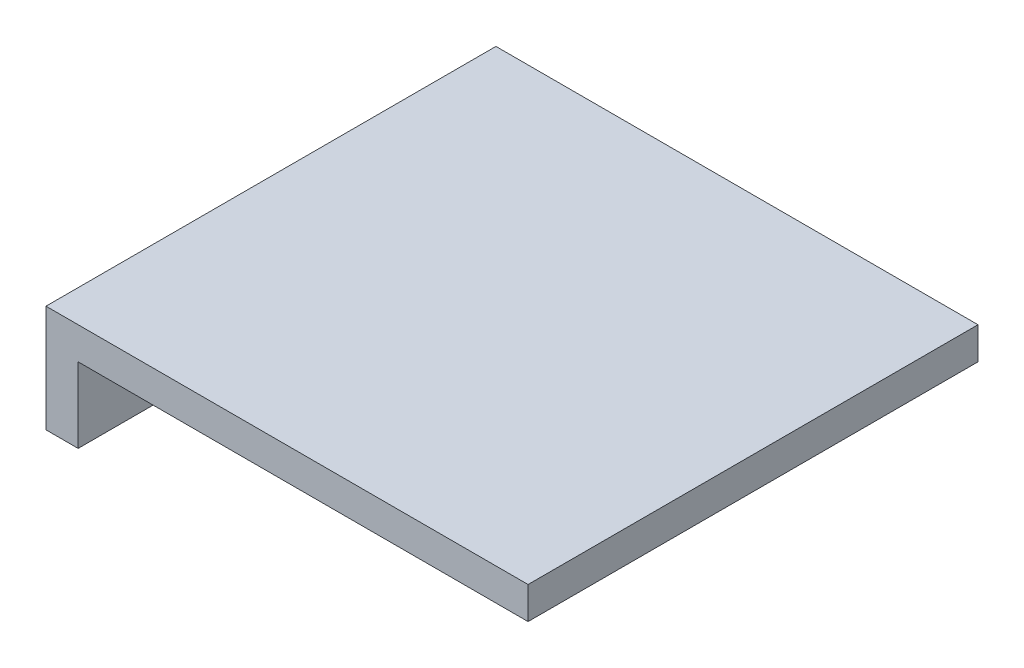
ISO-10303-21;
HEADER;
FILE_DESCRIPTION(('STEP AP214'),'2;1');
FILE_NAME('part.step','',(''),(''),'','','');
FILE_SCHEMA(('AUTOMOTIVE_DESIGN { 1 0 10303 214 1 1 1 1 }'));
ENDSEC;
DATA;
#1=APPLICATION_CONTEXT('core data for automotive mechanical design processes');
#2=APPLICATION_PROTOCOL_DEFINITION('international standard','automotive_design',2000,#1);
#3=PRODUCT_CONTEXT('',#1,'mechanical');
#4=PRODUCT('Part','Part','',(#3));
#5=PRODUCT_RELATED_PRODUCT_CATEGORY('part','',(#4));
#6=PRODUCT_DEFINITION_FORMATION('','',#4);
#7=PRODUCT_DEFINITION_CONTEXT('part definition',#1,'design');
#8=PRODUCT_DEFINITION('design','',#6,#7);
#9=PRODUCT_DEFINITION_SHAPE('','',#8);
#10=(LENGTH_UNIT() NAMED_UNIT(*) SI_UNIT(.MILLI.,.METRE.));
#11=(NAMED_UNIT(*) PLANE_ANGLE_UNIT() SI_UNIT($,.RADIAN.));
#12=(NAMED_UNIT(*) SI_UNIT($,.STERADIAN.) SOLID_ANGLE_UNIT());
#13=UNCERTAINTY_MEASURE_WITH_UNIT(LENGTH_MEASURE(1.E-05),#10,'distance_accuracy_value','');
#14=(GEOMETRIC_REPRESENTATION_CONTEXT(3) GLOBAL_UNCERTAINTY_ASSIGNED_CONTEXT((#13)) GLOBAL_UNIT_ASSIGNED_CONTEXT((#10,
#11,#12)) REPRESENTATION_CONTEXT('',''));
#15=CARTESIAN_POINT('',(0.,0.,0.));
#16=DIRECTION('',(0.,0.,1.));
#17=DIRECTION('',(1.,0.,0.));
#18=AXIS2_PLACEMENT_3D('',#15,#16,#17);
#19=CARTESIAN_POINT('',(-3.,0.,42.));
#20=DIRECTION('',(0.,1.,0.));
#21=DIRECTION('',(0.,0.,1.));
#22=AXIS2_PLACEMENT_3D('',#19,#20,#21);
#23=PLANE('',#22);
#24=DIRECTION('',(1.,0.,0.));
#25=VECTOR('',#24,1.);
#26=CARTESIAN_POINT('',(-3.,0.,0.));
#27=LINE('',#26,#25);
#28=CARTESIAN_POINT('',(-3.,0.,0.));
#29=VERTEX_POINT('',#28);
#30=CARTESIAN_POINT('',(0.,0.,0.));
#31=VERTEX_POINT('',#30);
#32=EDGE_CURVE('E117',#29,#31,#27,.T.);
#33=ORIENTED_EDGE('',*,*,#32,.T.);
#34=DIRECTION('',(0.,0.,-1.));
#35=VECTOR('',#34,1.);
#36=CARTESIAN_POINT('',(0.,0.,42.));
#37=LINE('',#36,#35);
#38=CARTESIAN_POINT('',(0.,0.,42.));
#39=VERTEX_POINT('',#38);
#40=EDGE_CURVE('E11',#39,#31,#37,.T.);
#41=ORIENTED_EDGE('',*,*,#40,.F.);
#42=DIRECTION('',(1.,0.,0.));
#43=VECTOR('',#42,1.);
#44=CARTESIAN_POINT('',(-3.,0.,42.));
#45=LINE('',#44,#43);
#46=CARTESIAN_POINT('',(-3.,0.,42.));
#47=VERTEX_POINT('',#46);
#48=EDGE_CURVE('E127',#47,#39,#45,.T.);
#49=ORIENTED_EDGE('',*,*,#48,.F.);
#50=DIRECTION('',(0.,0.,-1.));
#51=VECTOR('',#50,1.);
#52=CARTESIAN_POINT('',(-3.,0.,42.));
#53=LINE('',#52,#51);
#54=EDGE_CURVE('E113',#47,#29,#53,.T.);
#55=ORIENTED_EDGE('',*,*,#54,.T.);
#56=EDGE_LOOP('',(#33,#41,#49,#55));
#57=FACE_BOUND('',#56,.T.);
#58=ADVANCED_FACE('F33',(#57),#23,.F.);
#59=CARTESIAN_POINT('',(0.,0.,42.));
#60=DIRECTION('',(-1.,0.,0.));
#61=DIRECTION('',(0.,0.,1.));
#62=AXIS2_PLACEMENT_3D('',#59,#60,#61);
#63=PLANE('',#62);
#64=DIRECTION('',(0.,1.,0.));
#65=VECTOR('',#64,1.);
#66=CARTESIAN_POINT('',(0.,0.,0.));
#67=LINE('',#66,#65);
#68=CARTESIAN_POINT('',(0.,7.,0.));
#69=VERTEX_POINT('',#68);
#70=EDGE_CURVE('E120',#31,#69,#67,.T.);
#71=ORIENTED_EDGE('',*,*,#70,.T.);
#72=DIRECTION('',(0.,0.,-1.));
#73=VECTOR('',#72,1.);
#74=CARTESIAN_POINT('',(0.,7.,42.));
#75=LINE('',#74,#73);
#76=CARTESIAN_POINT('',(0.,7.,42.));
#77=VERTEX_POINT('',#76);
#78=EDGE_CURVE('E41',#77,#69,#75,.T.);
#79=ORIENTED_EDGE('',*,*,#78,.F.);
#80=DIRECTION('',(0.,1.,0.));
#81=VECTOR('',#80,1.);
#82=CARTESIAN_POINT('',(0.,0.,42.));
#83=LINE('',#82,#81);
#84=EDGE_CURVE('E86',#39,#77,#83,.T.);
#85=ORIENTED_EDGE('',*,*,#84,.F.);
#86=ORIENTED_EDGE('',*,*,#40,.T.);
#87=EDGE_LOOP('',(#71,#79,#85,#86));
#88=FACE_BOUND('',#87,.T.);
#89=ADVANCED_FACE('F151',(#88),#63,.F.);
#90=CARTESIAN_POINT('',(0.,7.,42.));
#91=DIRECTION('',(0.,1.,0.));
#92=DIRECTION('',(0.,0.,1.));
#93=AXIS2_PLACEMENT_3D('',#90,#91,#92);
#94=PLANE('',#93);
#95=DIRECTION('',(1.,0.,0.));
#96=VECTOR('',#95,1.);
#97=CARTESIAN_POINT('',(0.,7.,0.));
#98=LINE('',#97,#96);
#99=CARTESIAN_POINT('',(42.,7.,0.));
#100=VERTEX_POINT('',#99);
#101=EDGE_CURVE('E122',#69,#100,#98,.T.);
#102=ORIENTED_EDGE('',*,*,#101,.T.);
#103=DIRECTION('',(0.,0.,-1.));
#104=VECTOR('',#103,1.);
#105=CARTESIAN_POINT('',(42.,7.,42.));
#106=LINE('',#105,#104);
#107=CARTESIAN_POINT('',(42.,7.,42.));
#108=VERTEX_POINT('',#107);
#109=EDGE_CURVE('E108',#108,#100,#106,.T.);
#110=ORIENTED_EDGE('',*,*,#109,.F.);
#111=DIRECTION('',(1.,0.,0.));
#112=VECTOR('',#111,1.);
#113=CARTESIAN_POINT('',(0.,7.,42.));
#114=LINE('',#113,#112);
#115=EDGE_CURVE('E99',#77,#108,#114,.T.);
#116=ORIENTED_EDGE('',*,*,#115,.F.);
#117=ORIENTED_EDGE('',*,*,#78,.T.);
#118=EDGE_LOOP('',(#102,#110,#116,#117));
#119=FACE_BOUND('',#118,.T.);
#120=ADVANCED_FACE('F133',(#119),#94,.F.);
#121=CARTESIAN_POINT('',(42.,10.,42.));
#122=DIRECTION('',(-1.,0.,0.));
#123=DIRECTION('',(0.,0.,1.));
#124=AXIS2_PLACEMENT_3D('',#121,#122,#123);
#125=PLANE('',#124);
#126=DIRECTION('',(0.,1.,0.));
#127=VECTOR('',#126,1.);
#128=CARTESIAN_POINT('',(42.,10.,0.));
#129=LINE('',#128,#127);
#130=CARTESIAN_POINT('',(42.,10.,0.));
#131=VERTEX_POINT('',#130);
#132=EDGE_CURVE('E107',#100,#131,#129,.T.);
#133=ORIENTED_EDGE('',*,*,#132,.T.);
#134=DIRECTION('',(0.,0.,-1.));
#135=VECTOR('',#134,1.);
#136=CARTESIAN_POINT('',(42.,10.,42.));
#137=LINE('',#136,#135);
#138=CARTESIAN_POINT('',(42.,10.,42.));
#139=VERTEX_POINT('',#138);
#140=EDGE_CURVE('E104',#139,#131,#137,.T.);
#141=ORIENTED_EDGE('',*,*,#140,.F.);
#142=DIRECTION('',(0.,1.,0.));
#143=VECTOR('',#142,1.);
#144=CARTESIAN_POINT('',(42.,10.,42.));
#145=LINE('',#144,#143);
#146=EDGE_CURVE('E93',#108,#139,#145,.T.);
#147=ORIENTED_EDGE('',*,*,#146,.F.);
#148=ORIENTED_EDGE('',*,*,#109,.T.);
#149=EDGE_LOOP('',(#133,#141,#147,#148));
#150=FACE_BOUND('',#149,.T.);
#151=ADVANCED_FACE('F105',(#150),#125,.F.);
#152=CARTESIAN_POINT('',(-3.,10.,42.));
#153=DIRECTION('',(0.,-1.,0.));
#154=DIRECTION('',(0.,0.,-1.));
#155=AXIS2_PLACEMENT_3D('',#152,#153,#154);
#156=PLANE('',#155);
#157=DIRECTION('',(-1.,0.,0.));
#158=VECTOR('',#157,1.);
#159=CARTESIAN_POINT('',(-3.,10.,0.));
#160=LINE('',#159,#158);
#161=CARTESIAN_POINT('',(-3.,10.,0.));
#162=VERTEX_POINT('',#161);
#163=EDGE_CURVE('E72',#131,#162,#160,.T.);
#164=ORIENTED_EDGE('',*,*,#163,.T.);
#165=DIRECTION('',(0.,0.,-1.));
#166=VECTOR('',#165,1.);
#167=CARTESIAN_POINT('',(-3.,10.,42.));
#168=LINE('',#167,#166);
#169=CARTESIAN_POINT('',(-3.,10.,42.));
#170=VERTEX_POINT('',#169);
#171=EDGE_CURVE('E109',#170,#162,#168,.T.);
#172=ORIENTED_EDGE('',*,*,#171,.F.);
#173=DIRECTION('',(-1.,0.,0.));
#174=VECTOR('',#173,1.);
#175=CARTESIAN_POINT('',(-3.,10.,42.));
#176=LINE('',#175,#174);
#177=EDGE_CURVE('E97',#139,#170,#176,.T.);
#178=ORIENTED_EDGE('',*,*,#177,.F.);
#179=ORIENTED_EDGE('',*,*,#140,.T.);
#180=EDGE_LOOP('',(#164,#172,#178,#179));
#181=FACE_BOUND('',#180,.T.);
#182=ADVANCED_FACE('F111',(#181),#156,.F.);
#183=CARTESIAN_POINT('',(-3.,0.,42.));
#184=DIRECTION('',(1.,0.,0.));
#185=DIRECTION('',(0.,0.,-1.));
#186=AXIS2_PLACEMENT_3D('',#183,#184,#185);
#187=PLANE('',#186);
#188=DIRECTION('',(0.,-1.,0.));
#189=VECTOR('',#188,1.);
#190=CARTESIAN_POINT('',(-3.,0.,0.));
#191=LINE('',#190,#189);
#192=EDGE_CURVE('E78',#162,#29,#191,.T.);
#193=ORIENTED_EDGE('',*,*,#192,.T.);
#194=ORIENTED_EDGE('',*,*,#54,.F.);
#195=DIRECTION('',(0.,-1.,0.));
#196=VECTOR('',#195,1.);
#197=CARTESIAN_POINT('',(-3.,0.,42.));
#198=LINE('',#197,#196);
#199=EDGE_CURVE('E49',#170,#47,#198,.T.);
#200=ORIENTED_EDGE('',*,*,#199,.F.);
#201=ORIENTED_EDGE('',*,*,#171,.T.);
#202=EDGE_LOOP('',(#193,#194,#200,#201));
#203=FACE_BOUND('',#202,.T.);
#204=ADVANCED_FACE('F140',(#203),#187,.F.);
#205=CARTESIAN_POINT('',(0.,0.,42.));
#206=DIRECTION('',(0.,0.,1.));
#207=DIRECTION('',(1.,0.,0.));
#208=AXIS2_PLACEMENT_3D('',#205,#206,#207);
#209=PLANE('',#208);
#210=ORIENTED_EDGE('',*,*,#48,.T.);
#211=ORIENTED_EDGE('',*,*,#84,.T.);
#212=ORIENTED_EDGE('',*,*,#115,.T.);
#213=ORIENTED_EDGE('',*,*,#146,.T.);
#214=ORIENTED_EDGE('',*,*,#177,.T.);
#215=ORIENTED_EDGE('',*,*,#199,.T.);
#216=EDGE_LOOP('',(#210,#211,#212,#213,#214,#215));
#217=FACE_BOUND('',#216,.T.);
#218=ADVANCED_FACE('F95',(#217),#209,.T.);
#219=CARTESIAN_POINT('',(0.,0.,0.));
#220=DIRECTION('',(0.,0.,1.));
#221=DIRECTION('',(1.,0.,0.));
#222=AXIS2_PLACEMENT_3D('',#219,#220,#221);
#223=PLANE('',#222);
#224=ORIENTED_EDGE('',*,*,#32,.F.);
#225=ORIENTED_EDGE('',*,*,#192,.F.);
#226=ORIENTED_EDGE('',*,*,#163,.F.);
#227=ORIENTED_EDGE('',*,*,#132,.F.);
#228=ORIENTED_EDGE('',*,*,#101,.F.);
#229=ORIENTED_EDGE('',*,*,#70,.F.);
#230=EDGE_LOOP('',(#224,#225,#226,#227,#228,#229));
#231=FACE_BOUND('',#230,.T.);
#232=ADVANCED_FACE('F136',(#231),#223,.F.);
#233=CLOSED_SHELL('',(#58,#89,#120,#151,#182,#204,#218,#232));
#234=MANIFOLD_SOLID_BREP('B2',#233);
#235=ADVANCED_BREP_SHAPE_REPRESENTATION('',(#18,#234),#14);
#236=SHAPE_DEFINITION_REPRESENTATION(#9,#235);
ENDSEC;
END-ISO-10303-21;
